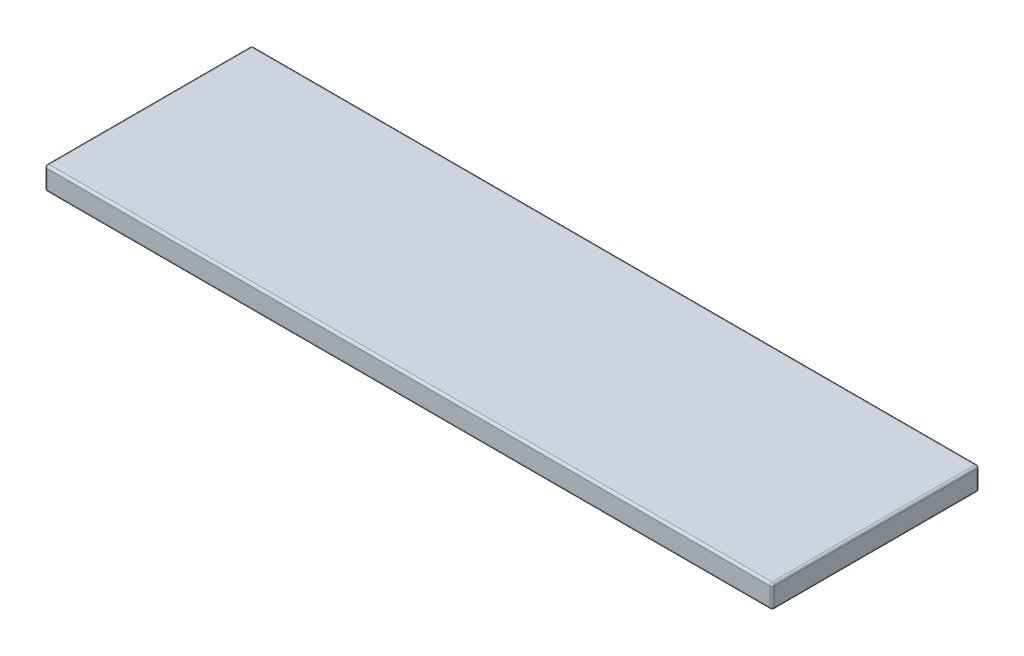
ISO-10303-21;
HEADER;
FILE_DESCRIPTION(('STEP AP214'),'2;1');
FILE_NAME('part.step','',(''),(''),'','','');
FILE_SCHEMA(('AUTOMOTIVE_DESIGN { 1 0 10303 214 1 1 1 1 }'));
ENDSEC;
DATA;
#1=APPLICATION_CONTEXT('core data for automotive mechanical design processes');
#2=APPLICATION_PROTOCOL_DEFINITION('international standard','automotive_design',2000,#1);
#3=PRODUCT_CONTEXT('',#1,'mechanical');
#4=PRODUCT('Part','Part','',(#3));
#5=PRODUCT_RELATED_PRODUCT_CATEGORY('part','',(#4));
#6=PRODUCT_DEFINITION_FORMATION('','',#4);
#7=PRODUCT_DEFINITION_CONTEXT('part definition',#1,'design');
#8=PRODUCT_DEFINITION('design','',#6,#7);
#9=PRODUCT_DEFINITION_SHAPE('','',#8);
#10=(LENGTH_UNIT() NAMED_UNIT(*) SI_UNIT(.MILLI.,.METRE.));
#11=(NAMED_UNIT(*) PLANE_ANGLE_UNIT() SI_UNIT($,.RADIAN.));
#12=(NAMED_UNIT(*) SI_UNIT($,.STERADIAN.) SOLID_ANGLE_UNIT());
#13=UNCERTAINTY_MEASURE_WITH_UNIT(LENGTH_MEASURE(1.E-05),#10,'distance_accuracy_value','');
#14=(GEOMETRIC_REPRESENTATION_CONTEXT(3) GLOBAL_UNCERTAINTY_ASSIGNED_CONTEXT((#13)) GLOBAL_UNIT_ASSIGNED_CONTEXT((#10,
#11,#12)) REPRESENTATION_CONTEXT('',''));
#15=CARTESIAN_POINT('',(0.,0.,0.));
#16=DIRECTION('',(0.,0.,1.));
#17=DIRECTION('',(1.,0.,0.));
#18=AXIS2_PLACEMENT_3D('',#15,#16,#17);
#19=CARTESIAN_POINT('',(79.,5.,22.5));
#20=DIRECTION('',(-1.,0.,0.));
#21=DIRECTION('',(0.,0.,1.));
#22=AXIS2_PLACEMENT_3D('',#19,#20,#21);
#23=PLANE('',#22);
#24=DIRECTION('',(0.,-1.,0.));
#25=VECTOR('',#24,1.);
#26=CARTESIAN_POINT('',(79.,5.,-22.));
#27=LINE('',#26,#25);
#28=CARTESIAN_POINT('',(79.,0.5,-22.));
#29=VERTEX_POINT('',#28);
#30=CARTESIAN_POINT('',(79.,4.5,-22.));
#31=VERTEX_POINT('',#30);
#32=EDGE_CURVE('E130',#29,#31,#27,.F.);
#33=ORIENTED_EDGE('',*,*,#32,.T.);
#34=DIRECTION('',(0.,0.,-1.));
#35=VECTOR('',#34,1.);
#36=CARTESIAN_POINT('',(79.,4.5,22.5));
#37=LINE('',#36,#35);
#38=CARTESIAN_POINT('',(79.,4.5,22.));
#39=VERTEX_POINT('',#38);
#40=EDGE_CURVE('E167',#31,#39,#37,.F.);
#41=ORIENTED_EDGE('',*,*,#40,.T.);
#42=DIRECTION('',(0.,-1.,0.));
#43=VECTOR('',#42,1.);
#44=CARTESIAN_POINT('',(79.,5.,22.));
#45=LINE('',#44,#43);
#46=CARTESIAN_POINT('',(79.,0.5,22.));
#47=VERTEX_POINT('',#46);
#48=EDGE_CURVE('E164',#39,#47,#45,.T.);
#49=ORIENTED_EDGE('',*,*,#48,.T.);
#50=DIRECTION('',(0.,0.,-1.));
#51=VECTOR('',#50,1.);
#52=CARTESIAN_POINT('',(79.,0.5,-22.5));
#53=LINE('',#52,#51);
#54=EDGE_CURVE('E159',#47,#29,#53,.T.);
#55=ORIENTED_EDGE('',*,*,#54,.T.);
#56=EDGE_LOOP('',(#33,#41,#49,#55));
#57=FACE_BOUND('',#56,.T.);
#58=ADVANCED_FACE('F34',(#57),#23,.F.);
#59=CARTESIAN_POINT('',(-79.,5.,-22.5));
#60=DIRECTION('',(0.,0.,1.));
#61=DIRECTION('',(1.,0.,0.));
#62=AXIS2_PLACEMENT_3D('',#59,#60,#61);
#63=PLANE('',#62);
#64=DIRECTION('',(0.,-1.,0.));
#65=VECTOR('',#64,1.);
#66=CARTESIAN_POINT('',(-78.5,5.,-22.5));
#67=LINE('',#66,#65);
#68=CARTESIAN_POINT('',(-78.5,0.5,-22.5));
#69=VERTEX_POINT('',#68);
#70=CARTESIAN_POINT('',(-78.5,4.5,-22.5));
#71=VERTEX_POINT('',#70);
#72=EDGE_CURVE('E152',#69,#71,#67,.F.);
#73=ORIENTED_EDGE('',*,*,#72,.T.);
#74=DIRECTION('',(-1.,0.,0.));
#75=VECTOR('',#74,1.);
#76=CARTESIAN_POINT('',(-79.,4.5,-22.5));
#77=LINE('',#76,#75);
#78=CARTESIAN_POINT('',(78.5,4.5,-22.5));
#79=VERTEX_POINT('',#78);
#80=EDGE_CURVE('E156',#71,#79,#77,.F.);
#81=ORIENTED_EDGE('',*,*,#80,.T.);
#82=DIRECTION('',(0.,-1.,0.));
#83=VECTOR('',#82,1.);
#84=CARTESIAN_POINT('',(78.5,5.,-22.5));
#85=LINE('',#84,#83);
#86=CARTESIAN_POINT('',(78.5,0.5,-22.5));
#87=VERTEX_POINT('',#86);
#88=EDGE_CURVE('E128',#79,#87,#85,.T.);
#89=ORIENTED_EDGE('',*,*,#88,.T.);
#90=DIRECTION('',(-1.,0.,0.));
#91=VECTOR('',#90,1.);
#92=CARTESIAN_POINT('',(-79.,0.5,-22.5));
#93=LINE('',#92,#91);
#94=EDGE_CURVE('E146',#87,#69,#93,.T.);
#95=ORIENTED_EDGE('',*,*,#94,.T.);
#96=EDGE_LOOP('',(#73,#81,#89,#95));
#97=FACE_BOUND('',#96,.T.);
#98=ADVANCED_FACE('F154',(#97),#63,.F.);
#99=CARTESIAN_POINT('',(-79.,5.,22.5));
#100=DIRECTION('',(1.,0.,0.));
#101=DIRECTION('',(0.,0.,-1.));
#102=AXIS2_PLACEMENT_3D('',#99,#100,#101);
#103=PLANE('',#102);
#104=DIRECTION('',(0.,-1.,0.));
#105=VECTOR('',#104,1.);
#106=CARTESIAN_POINT('',(-79.,5.,22.));
#107=LINE('',#106,#105);
#108=CARTESIAN_POINT('',(-79.,0.5,22.));
#109=VERTEX_POINT('',#108);
#110=CARTESIAN_POINT('',(-79.,4.5,22.));
#111=VERTEX_POINT('',#110);
#112=EDGE_CURVE('E171',#109,#111,#107,.F.);
#113=ORIENTED_EDGE('',*,*,#112,.T.);
#114=DIRECTION('',(0.,0.,1.));
#115=VECTOR('',#114,1.);
#116=CARTESIAN_POINT('',(-79.,4.5,22.5));
#117=LINE('',#116,#115);
#118=CARTESIAN_POINT('',(-79.,4.5,-22.));
#119=VERTEX_POINT('',#118);
#120=EDGE_CURVE('E176',#111,#119,#117,.F.);
#121=ORIENTED_EDGE('',*,*,#120,.T.);
#122=DIRECTION('',(0.,-1.,0.));
#123=VECTOR('',#122,1.);
#124=CARTESIAN_POINT('',(-79.,5.,-22.));
#125=LINE('',#124,#123);
#126=CARTESIAN_POINT('',(-79.,0.5,-22.));
#127=VERTEX_POINT('',#126);
#128=EDGE_CURVE('E173',#119,#127,#125,.T.);
#129=ORIENTED_EDGE('',*,*,#128,.T.);
#130=DIRECTION('',(0.,0.,1.));
#131=VECTOR('',#130,1.);
#132=CARTESIAN_POINT('',(-79.,0.5,22.5));
#133=LINE('',#132,#131);
#134=EDGE_CURVE('E169',#127,#109,#133,.T.);
#135=ORIENTED_EDGE('',*,*,#134,.T.);
#136=EDGE_LOOP('',(#113,#121,#129,#135));
#137=FACE_BOUND('',#136,.T.);
#138=ADVANCED_FACE('F281',(#137),#103,.F.);
#139=CARTESIAN_POINT('',(-79.,5.,22.5));
#140=DIRECTION('',(0.,0.,-1.));
#141=DIRECTION('',(-1.,0.,0.));
#142=AXIS2_PLACEMENT_3D('',#139,#140,#141);
#143=PLANE('',#142);
#144=DIRECTION('',(0.,-1.,0.));
#145=VECTOR('',#144,1.);
#146=CARTESIAN_POINT('',(78.5,5.,22.5));
#147=LINE('',#146,#145);
#148=CARTESIAN_POINT('',(78.5,0.5,22.5));
#149=VERTEX_POINT('',#148);
#150=CARTESIAN_POINT('',(78.5,4.5,22.5));
#151=VERTEX_POINT('',#150);
#152=EDGE_CURVE('E180',#149,#151,#147,.F.);
#153=ORIENTED_EDGE('',*,*,#152,.T.);
#154=DIRECTION('',(1.,0.,0.));
#155=VECTOR('',#154,1.);
#156=CARTESIAN_POINT('',(-79.,4.5,22.5));
#157=LINE('',#156,#155);
#158=CARTESIAN_POINT('',(-78.5,4.5,22.5));
#159=VERTEX_POINT('',#158);
#160=EDGE_CURVE('E185',#151,#159,#157,.F.);
#161=ORIENTED_EDGE('',*,*,#160,.T.);
#162=DIRECTION('',(0.,-1.,0.));
#163=VECTOR('',#162,1.);
#164=CARTESIAN_POINT('',(-78.5,5.,22.5));
#165=LINE('',#164,#163);
#166=CARTESIAN_POINT('',(-78.5,0.5,22.5));
#167=VERTEX_POINT('',#166);
#168=EDGE_CURVE('E182',#159,#167,#165,.T.);
#169=ORIENTED_EDGE('',*,*,#168,.T.);
#170=DIRECTION('',(1.,0.,0.));
#171=VECTOR('',#170,1.);
#172=CARTESIAN_POINT('',(79.,0.5,22.5));
#173=LINE('',#172,#171);
#174=EDGE_CURVE('E178',#167,#149,#173,.T.);
#175=ORIENTED_EDGE('',*,*,#174,.T.);
#176=EDGE_LOOP('',(#153,#161,#169,#175));
#177=FACE_BOUND('',#176,.T.);
#178=ADVANCED_FACE('F292',(#177),#143,.F.);
#179=CARTESIAN_POINT('',(0.,5.,0.));
#180=DIRECTION('',(0.,-1.,0.));
#181=DIRECTION('',(0.,0.,-1.));
#182=AXIS2_PLACEMENT_3D('',#179,#180,#181);
#183=PLANE('',#182);
#184=DIRECTION('',(0.,0.,1.));
#185=VECTOR('',#184,1.);
#186=CARTESIAN_POINT('',(-78.5,5.,0.));
#187=LINE('',#186,#185);
#188=CARTESIAN_POINT('',(-78.5,5.,-22.));
#189=VERTEX_POINT('',#188);
#190=CARTESIAN_POINT('',(-78.5,5.,22.));
#191=VERTEX_POINT('',#190);
#192=EDGE_CURVE('E191',#189,#191,#187,.T.);
#193=ORIENTED_EDGE('',*,*,#192,.T.);
#194=DIRECTION('',(1.,0.,0.));
#195=VECTOR('',#194,1.);
#196=CARTESIAN_POINT('',(0.,5.,22.));
#197=LINE('',#196,#195);
#198=CARTESIAN_POINT('',(78.5,5.,22.));
#199=VERTEX_POINT('',#198);
#200=EDGE_CURVE('E193',#191,#199,#197,.T.);
#201=ORIENTED_EDGE('',*,*,#200,.T.);
#202=DIRECTION('',(0.,0.,-1.));
#203=VECTOR('',#202,1.);
#204=CARTESIAN_POINT('',(78.5,5.,0.));
#205=LINE('',#204,#203);
#206=CARTESIAN_POINT('',(78.5,5.,-22.));
#207=VERTEX_POINT('',#206);
#208=EDGE_CURVE('E187',#199,#207,#205,.T.);
#209=ORIENTED_EDGE('',*,*,#208,.T.);
#210=DIRECTION('',(-1.,0.,0.));
#211=VECTOR('',#210,1.);
#212=CARTESIAN_POINT('',(0.,5.,-22.));
#213=LINE('',#212,#211);
#214=EDGE_CURVE('E189',#207,#189,#213,.T.);
#215=ORIENTED_EDGE('',*,*,#214,.T.);
#216=EDGE_LOOP('',(#193,#201,#209,#215));
#217=FACE_BOUND('',#216,.T.);
#218=ADVANCED_FACE('F273',(#217),#183,.F.);
#219=CARTESIAN_POINT('',(0.,0.,0.));
#220=DIRECTION('',(0.,-1.,0.));
#221=DIRECTION('',(0.,0.,-1.));
#222=AXIS2_PLACEMENT_3D('',#219,#220,#221);
#223=PLANE('',#222);
#224=DIRECTION('',(0.,0.,1.));
#225=VECTOR('',#224,1.);
#226=CARTESIAN_POINT('',(-78.5,0.,-22.5));
#227=LINE('',#226,#225);
#228=CARTESIAN_POINT('',(-78.5,0.,22.));
#229=VERTEX_POINT('',#228);
#230=CARTESIAN_POINT('',(-78.5,0.,-22.));
#231=VERTEX_POINT('',#230);
#232=EDGE_CURVE('E43',#229,#231,#227,.F.);
#233=ORIENTED_EDGE('',*,*,#232,.T.);
#234=DIRECTION('',(-1.,0.,0.));
#235=VECTOR('',#234,1.);
#236=CARTESIAN_POINT('',(79.,0.,-22.));
#237=LINE('',#236,#235);
#238=CARTESIAN_POINT('',(78.5,0.,-22.));
#239=VERTEX_POINT('',#238);
#240=EDGE_CURVE('E11',#231,#239,#237,.F.);
#241=ORIENTED_EDGE('',*,*,#240,.T.);
#242=DIRECTION('',(0.,0.,-1.));
#243=VECTOR('',#242,1.);
#244=CARTESIAN_POINT('',(78.5,0.,22.5));
#245=LINE('',#244,#243);
#246=CARTESIAN_POINT('',(78.5,0.,22.));
#247=VERTEX_POINT('',#246);
#248=EDGE_CURVE('E196',#239,#247,#245,.F.);
#249=ORIENTED_EDGE('',*,*,#248,.T.);
#250=DIRECTION('',(1.,0.,0.));
#251=VECTOR('',#250,1.);
#252=CARTESIAN_POINT('',(-79.,0.,22.));
#253=LINE('',#252,#251);
#254=EDGE_CURVE('E54',#247,#229,#253,.F.);
#255=ORIENTED_EDGE('',*,*,#254,.T.);
#256=EDGE_LOOP('',(#233,#241,#249,#255));
#257=FACE_BOUND('',#256,.T.);
#258=ADVANCED_FACE('F479',(#257),#223,.T.);
#259=CARTESIAN_POINT('',(-78.5,5.,22.));
#260=DIRECTION('',(0.,-1.,0.));
#261=DIRECTION('',(0.,0.,-1.));
#262=AXIS2_PLACEMENT_3D('',#259,#260,#261);
#263=CYLINDRICAL_SURFACE('',#262,0.5);
#264=CARTESIAN_POINT('',(-78.5,4.5,22.));
#265=DIRECTION('',(0.,1.,0.));
#266=DIRECTION('',(0.,0.,1.));
#267=AXIS2_PLACEMENT_3D('',#264,#265,#266);
#268=CIRCLE('',#267,0.5);
#269=EDGE_CURVE('E38',#111,#159,#268,.T.);
#270=ORIENTED_EDGE('',*,*,#269,.F.);
#271=ORIENTED_EDGE('',*,*,#112,.F.);
#272=CARTESIAN_POINT('',(-78.5,0.5,22.));
#273=DIRECTION('',(0.,-1.,0.));
#274=DIRECTION('',(0.,0.,-1.));
#275=AXIS2_PLACEMENT_3D('',#272,#273,#274);
#276=CIRCLE('',#275,0.5);
#277=EDGE_CURVE('E250',#167,#109,#276,.T.);
#278=ORIENTED_EDGE('',*,*,#277,.F.);
#279=ORIENTED_EDGE('',*,*,#168,.F.);
#280=EDGE_LOOP('',(#270,#271,#278,#279));
#281=FACE_BOUND('',#280,.T.);
#282=ADVANCED_FACE('F36',(#281),#263,.T.);
#283=CARTESIAN_POINT('',(-78.5,4.5,22.));
#284=DIRECTION('',(0.,0.,1.));
#285=DIRECTION('',(1.,0.,0.));
#286=AXIS2_PLACEMENT_3D('',#283,#284,#285);
#287=SPHERICAL_SURFACE('',#286,0.5);
#288=CARTESIAN_POINT('',(-78.5,4.5,22.));
#289=DIRECTION('',(0.,0.,1.));
#290=DIRECTION('',(1.,0.,0.));
#291=AXIS2_PLACEMENT_3D('',#288,#289,#290);
#292=CIRCLE('',#291,0.5);
#293=EDGE_CURVE('E245',#111,#191,#292,.F.);
#294=ORIENTED_EDGE('',*,*,#293,.F.);
#295=ORIENTED_EDGE('',*,*,#269,.T.);
#296=CARTESIAN_POINT('',(-78.5,4.5,22.));
#297=DIRECTION('',(-1.,0.,0.));
#298=DIRECTION('',(0.,0.,1.));
#299=AXIS2_PLACEMENT_3D('',#296,#297,#298);
#300=CIRCLE('',#299,0.5);
#301=EDGE_CURVE('E248',#191,#159,#300,.F.);
#302=ORIENTED_EDGE('',*,*,#301,.F.);
#303=EDGE_LOOP('',(#294,#295,#302));
#304=FACE_BOUND('',#303,.T.);
#305=ADVANCED_FACE('F261',(#304),#287,.T.);
#306=CARTESIAN_POINT('',(-78.5,0.5,22.));
#307=DIRECTION('',(0.,0.,1.));
#308=DIRECTION('',(1.,0.,0.));
#309=AXIS2_PLACEMENT_3D('',#306,#307,#308);
#310=SPHERICAL_SURFACE('',#309,0.5);
#311=CARTESIAN_POINT('',(-78.5,0.5,22.));
#312=DIRECTION('',(-1.,0.,0.));
#313=DIRECTION('',(0.,0.,1.));
#314=AXIS2_PLACEMENT_3D('',#311,#312,#313);
#315=CIRCLE('',#314,0.5);
#316=EDGE_CURVE('E240',#167,#229,#315,.F.);
#317=ORIENTED_EDGE('',*,*,#316,.F.);
#318=ORIENTED_EDGE('',*,*,#277,.T.);
#319=CARTESIAN_POINT('',(-78.5,0.5,22.));
#320=DIRECTION('',(0.,0.,1.));
#321=DIRECTION('',(1.,0.,0.));
#322=AXIS2_PLACEMENT_3D('',#319,#320,#321);
#323=CIRCLE('',#322,0.5);
#324=EDGE_CURVE('E242',#229,#109,#323,.F.);
#325=ORIENTED_EDGE('',*,*,#324,.F.);
#326=EDGE_LOOP('',(#317,#318,#325));
#327=FACE_BOUND('',#326,.T.);
#328=ADVANCED_FACE('F458',(#327),#310,.T.);
#329=CARTESIAN_POINT('',(0.,4.5,22.));
#330=DIRECTION('',(1.,0.,0.));
#331=DIRECTION('',(0.,0.,-1.));
#332=AXIS2_PLACEMENT_3D('',#329,#330,#331);
#333=CYLINDRICAL_SURFACE('',#332,0.5);
#334=ORIENTED_EDGE('',*,*,#301,.T.);
#335=ORIENTED_EDGE('',*,*,#160,.F.);
#336=CARTESIAN_POINT('',(78.5,4.5,22.));
#337=DIRECTION('',(1.,0.,0.));
#338=DIRECTION('',(0.,0.,-1.));
#339=AXIS2_PLACEMENT_3D('',#336,#337,#338);
#340=CIRCLE('',#339,0.5);
#341=EDGE_CURVE('E234',#199,#151,#340,.T.);
#342=ORIENTED_EDGE('',*,*,#341,.F.);
#343=ORIENTED_EDGE('',*,*,#200,.F.);
#344=EDGE_LOOP('',(#334,#335,#342,#343));
#345=FACE_BOUND('',#344,.T.);
#346=ADVANCED_FACE('F269',(#345),#333,.T.);
#347=CARTESIAN_POINT('',(-78.5,4.5,0.));
#348=DIRECTION('',(0.,0.,1.));
#349=DIRECTION('',(1.,0.,0.));
#350=AXIS2_PLACEMENT_3D('',#347,#348,#349);
#351=CYLINDRICAL_SURFACE('',#350,0.5);
#352=ORIENTED_EDGE('',*,*,#293,.T.);
#353=ORIENTED_EDGE('',*,*,#192,.F.);
#354=CARTESIAN_POINT('',(-78.5,4.5,-22.));
#355=DIRECTION('',(0.,0.,-1.));
#356=DIRECTION('',(-1.,0.,0.));
#357=AXIS2_PLACEMENT_3D('',#354,#355,#356);
#358=CIRCLE('',#357,0.5);
#359=EDGE_CURVE('E231',#119,#189,#358,.T.);
#360=ORIENTED_EDGE('',*,*,#359,.F.);
#361=ORIENTED_EDGE('',*,*,#120,.F.);
#362=EDGE_LOOP('',(#352,#353,#360,#361));
#363=FACE_BOUND('',#362,.T.);
#364=ADVANCED_FACE('F278',(#363),#351,.T.);
#365=CARTESIAN_POINT('',(-78.5,5.,-22.));
#366=DIRECTION('',(0.,-1.,0.));
#367=DIRECTION('',(0.,0.,-1.));
#368=AXIS2_PLACEMENT_3D('',#365,#366,#367);
#369=CYLINDRICAL_SURFACE('',#368,0.5);
#370=CARTESIAN_POINT('',(-78.5,0.5,-22.));
#371=DIRECTION('',(0.,-1.,0.));
#372=DIRECTION('',(0.,0.,-1.));
#373=AXIS2_PLACEMENT_3D('',#370,#371,#372);
#374=CIRCLE('',#373,0.5);
#375=EDGE_CURVE('E225',#127,#69,#374,.T.);
#376=ORIENTED_EDGE('',*,*,#375,.F.);
#377=ORIENTED_EDGE('',*,*,#128,.F.);
#378=CARTESIAN_POINT('',(-78.5,4.5,-22.));
#379=DIRECTION('',(0.,1.,0.));
#380=DIRECTION('',(0.,0.,1.));
#381=AXIS2_PLACEMENT_3D('',#378,#379,#380);
#382=CIRCLE('',#381,0.5);
#383=EDGE_CURVE('E228',#71,#119,#382,.T.);
#384=ORIENTED_EDGE('',*,*,#383,.F.);
#385=ORIENTED_EDGE('',*,*,#72,.F.);
#386=EDGE_LOOP('',(#376,#377,#384,#385));
#387=FACE_BOUND('',#386,.T.);
#388=ADVANCED_FACE('F285',(#387),#369,.T.);
#389=CARTESIAN_POINT('',(-78.5,0.5,22.5));
#390=DIRECTION('',(0.,0.,-1.));
#391=DIRECTION('',(-1.,0.,0.));
#392=AXIS2_PLACEMENT_3D('',#389,#390,#391);
#393=CYLINDRICAL_SURFACE('',#392,0.5);
#394=ORIENTED_EDGE('',*,*,#324,.T.);
#395=ORIENTED_EDGE('',*,*,#134,.F.);
#396=CARTESIAN_POINT('',(-78.5,0.5,-22.));
#397=DIRECTION('',(0.,0.,-1.));
#398=DIRECTION('',(-1.,0.,0.));
#399=AXIS2_PLACEMENT_3D('',#396,#397,#398);
#400=CIRCLE('',#399,0.5);
#401=EDGE_CURVE('E223',#231,#127,#400,.T.);
#402=ORIENTED_EDGE('',*,*,#401,.F.);
#403=ORIENTED_EDGE('',*,*,#232,.F.);
#404=EDGE_LOOP('',(#394,#395,#402,#403));
#405=FACE_BOUND('',#404,.T.);
#406=ADVANCED_FACE('F290',(#405),#393,.T.);
#407=CARTESIAN_POINT('',(-79.,0.5,22.));
#408=DIRECTION('',(-1.,0.,0.));
#409=DIRECTION('',(0.,0.,1.));
#410=AXIS2_PLACEMENT_3D('',#407,#408,#409);
#411=CYLINDRICAL_SURFACE('',#410,0.5);
#412=ORIENTED_EDGE('',*,*,#316,.T.);
#413=ORIENTED_EDGE('',*,*,#254,.F.);
#414=CARTESIAN_POINT('',(78.5,0.5,22.));
#415=DIRECTION('',(1.,0.,0.));
#416=DIRECTION('',(0.,0.,-1.));
#417=AXIS2_PLACEMENT_3D('',#414,#415,#416);
#418=CIRCLE('',#417,0.5);
#419=EDGE_CURVE('E220',#149,#247,#418,.T.);
#420=ORIENTED_EDGE('',*,*,#419,.F.);
#421=ORIENTED_EDGE('',*,*,#174,.F.);
#422=EDGE_LOOP('',(#412,#413,#420,#421));
#423=FACE_BOUND('',#422,.T.);
#424=ADVANCED_FACE('F301',(#423),#411,.T.);
#425=CARTESIAN_POINT('',(78.5,5.,22.));
#426=DIRECTION('',(0.,-1.,0.));
#427=DIRECTION('',(0.,0.,-1.));
#428=AXIS2_PLACEMENT_3D('',#425,#426,#427);
#429=CYLINDRICAL_SURFACE('',#428,0.5);
#430=CARTESIAN_POINT('',(78.5,4.5,22.));
#431=DIRECTION('',(0.,1.,0.));
#432=DIRECTION('',(0.,0.,1.));
#433=AXIS2_PLACEMENT_3D('',#430,#431,#432);
#434=CIRCLE('',#433,0.5);
#435=EDGE_CURVE('E237',#151,#39,#434,.T.);
#436=ORIENTED_EDGE('',*,*,#435,.F.);
#437=ORIENTED_EDGE('',*,*,#152,.F.);
#438=CARTESIAN_POINT('',(78.5,0.5,22.));
#439=DIRECTION('',(0.,-1.,0.));
#440=DIRECTION('',(0.,0.,-1.));
#441=AXIS2_PLACEMENT_3D('',#438,#439,#440);
#442=CIRCLE('',#441,0.5);
#443=EDGE_CURVE('E217',#47,#149,#442,.T.);
#444=ORIENTED_EDGE('',*,*,#443,.F.);
#445=ORIENTED_EDGE('',*,*,#48,.F.);
#446=EDGE_LOOP('',(#436,#437,#444,#445));
#447=FACE_BOUND('',#446,.T.);
#448=ADVANCED_FACE('F297',(#447),#429,.T.);
#449=CARTESIAN_POINT('',(78.5,4.5,22.));
#450=DIRECTION('',(0.,0.,1.));
#451=DIRECTION('',(1.,0.,0.));
#452=AXIS2_PLACEMENT_3D('',#449,#450,#451);
#453=SPHERICAL_SURFACE('',#452,0.5);
#454=ORIENTED_EDGE('',*,*,#341,.T.);
#455=ORIENTED_EDGE('',*,*,#435,.T.);
#456=CARTESIAN_POINT('',(78.5,4.5,22.));
#457=DIRECTION('',(0.,0.,1.));
#458=DIRECTION('',(1.,0.,0.));
#459=AXIS2_PLACEMENT_3D('',#456,#457,#458);
#460=CIRCLE('',#459,0.5);
#461=EDGE_CURVE('E214',#199,#39,#460,.F.);
#462=ORIENTED_EDGE('',*,*,#461,.F.);
#463=EDGE_LOOP('',(#454,#455,#462));
#464=FACE_BOUND('',#463,.T.);
#465=ADVANCED_FACE('F311',(#464),#453,.T.);
#466=CARTESIAN_POINT('',(-78.5,4.5,-22.));
#467=DIRECTION('',(0.,0.,1.));
#468=DIRECTION('',(1.,0.,0.));
#469=AXIS2_PLACEMENT_3D('',#466,#467,#468);
#470=SPHERICAL_SURFACE('',#469,0.5);
#471=ORIENTED_EDGE('',*,*,#383,.T.);
#472=ORIENTED_EDGE('',*,*,#359,.T.);
#473=CARTESIAN_POINT('',(-78.5,4.5,-22.));
#474=DIRECTION('',(-1.,0.,0.));
#475=DIRECTION('',(0.,0.,1.));
#476=AXIS2_PLACEMENT_3D('',#473,#474,#475);
#477=CIRCLE('',#476,0.5);
#478=EDGE_CURVE('E211',#71,#189,#477,.F.);
#479=ORIENTED_EDGE('',*,*,#478,.F.);
#480=EDGE_LOOP('',(#471,#472,#479));
#481=FACE_BOUND('',#480,.T.);
#482=ADVANCED_FACE('F321',(#481),#470,.T.);
#483=CARTESIAN_POINT('',(-78.5,0.5,-22.));
#484=DIRECTION('',(0.,0.,1.));
#485=DIRECTION('',(1.,0.,0.));
#486=AXIS2_PLACEMENT_3D('',#483,#484,#485);
#487=SPHERICAL_SURFACE('',#486,0.5);
#488=ORIENTED_EDGE('',*,*,#401,.T.);
#489=ORIENTED_EDGE('',*,*,#375,.T.);
#490=CARTESIAN_POINT('',(-78.5,0.5,-22.));
#491=DIRECTION('',(-1.,0.,0.));
#492=DIRECTION('',(0.,0.,1.));
#493=AXIS2_PLACEMENT_3D('',#490,#491,#492);
#494=CIRCLE('',#493,0.5);
#495=EDGE_CURVE('E149',#231,#69,#494,.F.);
#496=ORIENTED_EDGE('',*,*,#495,.F.);
#497=EDGE_LOOP('',(#488,#489,#496));
#498=FACE_BOUND('',#497,.T.);
#499=ADVANCED_FACE('F323',(#498),#487,.T.);
#500=CARTESIAN_POINT('',(78.5,0.5,22.));
#501=DIRECTION('',(0.,0.,1.));
#502=DIRECTION('',(1.,0.,0.));
#503=AXIS2_PLACEMENT_3D('',#500,#501,#502);
#504=SPHERICAL_SURFACE('',#503,0.5);
#505=ORIENTED_EDGE('',*,*,#443,.T.);
#506=ORIENTED_EDGE('',*,*,#419,.T.);
#507=CARTESIAN_POINT('',(78.5,0.5,22.));
#508=DIRECTION('',(0.,0.,1.));
#509=DIRECTION('',(1.,0.,0.));
#510=AXIS2_PLACEMENT_3D('',#507,#508,#509);
#511=CIRCLE('',#510,0.5);
#512=EDGE_CURVE('E207',#47,#247,#511,.F.);
#513=ORIENTED_EDGE('',*,*,#512,.F.);
#514=EDGE_LOOP('',(#505,#506,#513));
#515=FACE_BOUND('',#514,.T.);
#516=ADVANCED_FACE('F303',(#515),#504,.T.);
#517=CARTESIAN_POINT('',(78.5,4.5,0.));
#518=DIRECTION('',(0.,0.,-1.));
#519=DIRECTION('',(-1.,0.,0.));
#520=AXIS2_PLACEMENT_3D('',#517,#518,#519);
#521=CYLINDRICAL_SURFACE('',#520,0.5);
#522=ORIENTED_EDGE('',*,*,#461,.T.);
#523=ORIENTED_EDGE('',*,*,#40,.F.);
#524=CARTESIAN_POINT('',(78.5,4.5,-22.));
#525=DIRECTION('',(0.,0.,-1.));
#526=DIRECTION('',(-1.,0.,0.));
#527=AXIS2_PLACEMENT_3D('',#524,#525,#526);
#528=CIRCLE('',#527,0.5);
#529=EDGE_CURVE('E204',#207,#31,#528,.T.);
#530=ORIENTED_EDGE('',*,*,#529,.F.);
#531=ORIENTED_EDGE('',*,*,#208,.F.);
#532=EDGE_LOOP('',(#522,#523,#530,#531));
#533=FACE_BOUND('',#532,.T.);
#534=ADVANCED_FACE('F313',(#533),#521,.T.);
#535=CARTESIAN_POINT('',(0.,4.5,-22.));
#536=DIRECTION('',(-1.,0.,0.));
#537=DIRECTION('',(0.,0.,1.));
#538=AXIS2_PLACEMENT_3D('',#535,#536,#537);
#539=CYLINDRICAL_SURFACE('',#538,0.5);
#540=ORIENTED_EDGE('',*,*,#478,.T.);
#541=ORIENTED_EDGE('',*,*,#214,.F.);
#542=CARTESIAN_POINT('',(78.5,4.5,-22.));
#543=DIRECTION('',(1.,0.,0.));
#544=DIRECTION('',(0.,0.,-1.));
#545=AXIS2_PLACEMENT_3D('',#542,#543,#544);
#546=CIRCLE('',#545,0.5);
#547=EDGE_CURVE('E143',#79,#207,#546,.T.);
#548=ORIENTED_EDGE('',*,*,#547,.F.);
#549=ORIENTED_EDGE('',*,*,#80,.F.);
#550=EDGE_LOOP('',(#540,#541,#548,#549));
#551=FACE_BOUND('',#550,.T.);
#552=ADVANCED_FACE('F319',(#551),#539,.T.);
#553=CARTESIAN_POINT('',(-79.,0.5,-22.));
#554=DIRECTION('',(1.,0.,0.));
#555=DIRECTION('',(0.,0.,-1.));
#556=AXIS2_PLACEMENT_3D('',#553,#554,#555);
#557=CYLINDRICAL_SURFACE('',#556,0.5);
#558=ORIENTED_EDGE('',*,*,#495,.T.);
#559=ORIENTED_EDGE('',*,*,#94,.F.);
#560=CARTESIAN_POINT('',(78.5,0.5,-22.));
#561=DIRECTION('',(1.,0.,0.));
#562=DIRECTION('',(0.,0.,-1.));
#563=AXIS2_PLACEMENT_3D('',#560,#561,#562);
#564=CIRCLE('',#563,0.5);
#565=EDGE_CURVE('E135',#239,#87,#564,.T.);
#566=ORIENTED_EDGE('',*,*,#565,.F.);
#567=ORIENTED_EDGE('',*,*,#240,.F.);
#568=EDGE_LOOP('',(#558,#559,#566,#567));
#569=FACE_BOUND('',#568,.T.);
#570=ADVANCED_FACE('F147',(#569),#557,.T.);
#571=CARTESIAN_POINT('',(78.5,0.5,22.5));
#572=DIRECTION('',(0.,0.,1.));
#573=DIRECTION('',(1.,0.,0.));
#574=AXIS2_PLACEMENT_3D('',#571,#572,#573);
#575=CYLINDRICAL_SURFACE('',#574,0.5);
#576=ORIENTED_EDGE('',*,*,#512,.T.);
#577=ORIENTED_EDGE('',*,*,#248,.F.);
#578=CARTESIAN_POINT('',(78.5,0.5,-22.));
#579=DIRECTION('',(0.,0.,-1.));
#580=DIRECTION('',(-1.,0.,0.));
#581=AXIS2_PLACEMENT_3D('',#578,#579,#580);
#582=CIRCLE('',#581,0.5);
#583=EDGE_CURVE('E139',#29,#239,#582,.T.);
#584=ORIENTED_EDGE('',*,*,#583,.F.);
#585=ORIENTED_EDGE('',*,*,#54,.F.);
#586=EDGE_LOOP('',(#576,#577,#584,#585));
#587=FACE_BOUND('',#586,.T.);
#588=ADVANCED_FACE('F306',(#587),#575,.T.);
#589=CARTESIAN_POINT('',(78.5,4.5,-22.));
#590=DIRECTION('',(0.,0.,1.));
#591=DIRECTION('',(1.,0.,0.));
#592=AXIS2_PLACEMENT_3D('',#589,#590,#591);
#593=SPHERICAL_SURFACE('',#592,0.5);
#594=ORIENTED_EDGE('',*,*,#547,.T.);
#595=ORIENTED_EDGE('',*,*,#529,.T.);
#596=CARTESIAN_POINT('',(78.5,4.5,-22.));
#597=DIRECTION('',(0.,1.,0.));
#598=DIRECTION('',(0.,0.,1.));
#599=AXIS2_PLACEMENT_3D('',#596,#597,#598);
#600=CIRCLE('',#599,0.5);
#601=EDGE_CURVE('E132',#79,#31,#600,.F.);
#602=ORIENTED_EDGE('',*,*,#601,.F.);
#603=EDGE_LOOP('',(#594,#595,#602));
#604=FACE_BOUND('',#603,.T.);
#605=ADVANCED_FACE('F317',(#604),#593,.T.);
#606=CARTESIAN_POINT('',(78.5,0.5,-22.));
#607=DIRECTION('',(0.,0.,1.));
#608=DIRECTION('',(1.,0.,0.));
#609=AXIS2_PLACEMENT_3D('',#606,#607,#608);
#610=SPHERICAL_SURFACE('',#609,0.5);
#611=ORIENTED_EDGE('',*,*,#583,.T.);
#612=ORIENTED_EDGE('',*,*,#565,.T.);
#613=CARTESIAN_POINT('',(78.5,0.5,-22.));
#614=DIRECTION('',(0.,-1.,0.));
#615=DIRECTION('',(0.,0.,-1.));
#616=AXIS2_PLACEMENT_3D('',#613,#614,#615);
#617=CIRCLE('',#616,0.5);
#618=EDGE_CURVE('E124',#29,#87,#617,.F.);
#619=ORIENTED_EDGE('',*,*,#618,.F.);
#620=EDGE_LOOP('',(#611,#612,#619));
#621=FACE_BOUND('',#620,.T.);
#622=ADVANCED_FACE('F137',(#621),#610,.T.);
#623=CARTESIAN_POINT('',(78.5,5.,-22.));
#624=DIRECTION('',(0.,-1.,0.));
#625=DIRECTION('',(0.,0.,-1.));
#626=AXIS2_PLACEMENT_3D('',#623,#624,#625);
#627=CYLINDRICAL_SURFACE('',#626,0.5);
#628=ORIENTED_EDGE('',*,*,#601,.T.);
#629=ORIENTED_EDGE('',*,*,#32,.F.);
#630=ORIENTED_EDGE('',*,*,#618,.T.);
#631=ORIENTED_EDGE('',*,*,#88,.F.);
#632=EDGE_LOOP('',(#628,#629,#630,#631));
#633=FACE_BOUND('',#632,.T.);
#634=ADVANCED_FACE('F126',(#633),#627,.T.);
#635=CLOSED_SHELL('',(#58,#98,#138,#178,#218,#258,#282,#305,#328,#346,#364,#388,#406,#424,#448,
#465,#482,#499,#516,#534,#552,#570,#588,#605,#622,#634));
#636=MANIFOLD_SOLID_BREP('B2',#635);
#637=ADVANCED_BREP_SHAPE_REPRESENTATION('',(#18,#636),#14);
#638=SHAPE_DEFINITION_REPRESENTATION(#9,#637);
ENDSEC;
END-ISO-10303-21;
